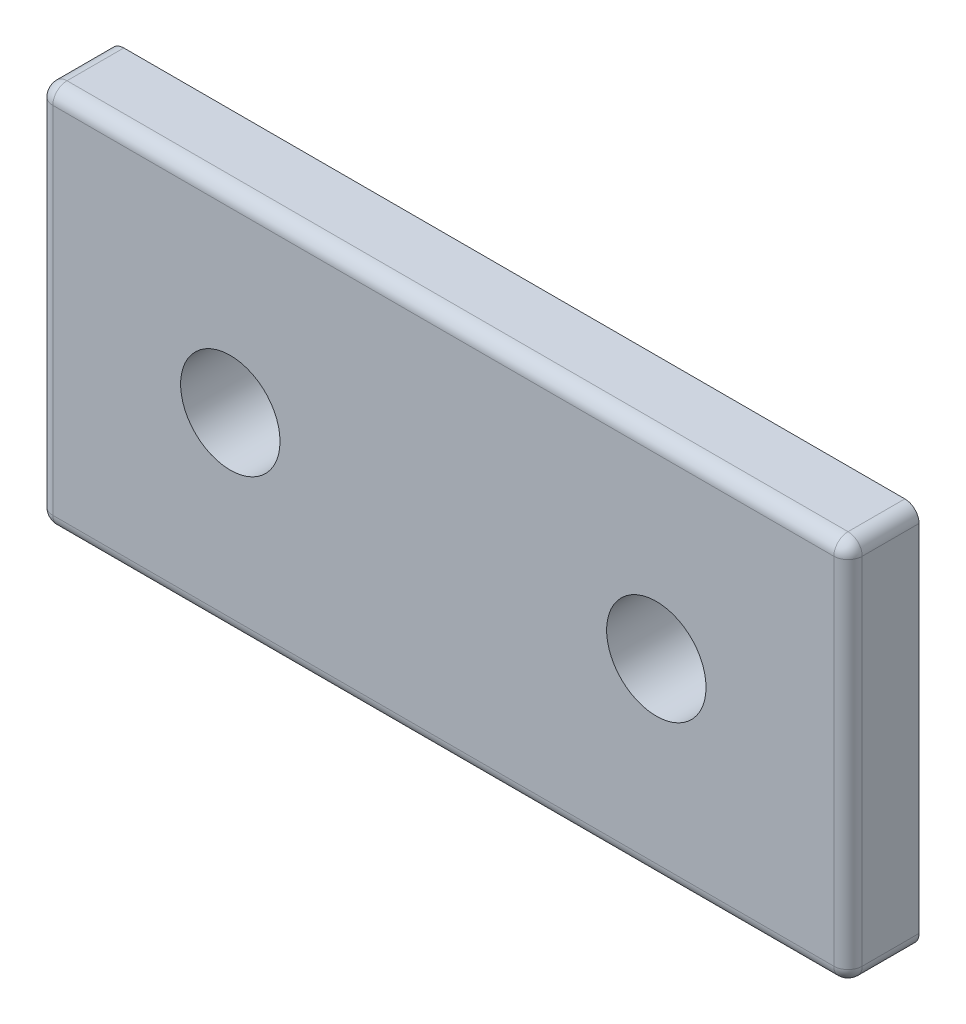
ISO-10303-21;
HEADER;
FILE_DESCRIPTION(('STEP AP214'),'2;1');
FILE_NAME('part.step','',(''),(''),'','','');
FILE_SCHEMA(('AUTOMOTIVE_DESIGN { 1 0 10303 214 1 1 1 1 }'));
ENDSEC;
DATA;
#1=APPLICATION_CONTEXT('core data for automotive mechanical design processes');
#2=APPLICATION_PROTOCOL_DEFINITION('international standard','automotive_design',2000,#1);
#3=PRODUCT_CONTEXT('',#1,'mechanical');
#4=PRODUCT('Part','Part','',(#3));
#5=PRODUCT_RELATED_PRODUCT_CATEGORY('part','',(#4));
#6=PRODUCT_DEFINITION_FORMATION('','',#4);
#7=PRODUCT_DEFINITION_CONTEXT('part definition',#1,'design');
#8=PRODUCT_DEFINITION('design','',#6,#7);
#9=PRODUCT_DEFINITION_SHAPE('','',#8);
#10=(LENGTH_UNIT() NAMED_UNIT(*) SI_UNIT(.MILLI.,.METRE.));
#11=(NAMED_UNIT(*) PLANE_ANGLE_UNIT() SI_UNIT($,.RADIAN.));
#12=(NAMED_UNIT(*) SI_UNIT($,.STERADIAN.) SOLID_ANGLE_UNIT());
#13=UNCERTAINTY_MEASURE_WITH_UNIT(LENGTH_MEASURE(1.E-05),#10,'distance_accuracy_value','');
#14=(GEOMETRIC_REPRESENTATION_CONTEXT(3) GLOBAL_UNCERTAINTY_ASSIGNED_CONTEXT((#13)) GLOBAL_UNIT_ASSIGNED_CONTEXT((#10,
#11,#12)) REPRESENTATION_CONTEXT('',''));
#15=CARTESIAN_POINT('',(0.,0.,0.));
#16=DIRECTION('',(0.,0.,1.));
#17=DIRECTION('',(1.,0.,0.));
#18=AXIS2_PLACEMENT_3D('',#15,#16,#17);
#19=CARTESIAN_POINT('',(0.,0.,2.5));
#20=DIRECTION('',(0.,0.,-1.));
#21=DIRECTION('',(-1.,0.,0.));
#22=AXIS2_PLACEMENT_3D('',#19,#20,#21);
#23=PLANE('',#22);
#24=DIRECTION('',(-1.,0.,0.));
#25=VECTOR('',#24,1.);
#26=CARTESIAN_POINT('',(0.,26.,2.5));
#27=LINE('',#26,#25);
#28=CARTESIAN_POINT('',(56.,26.,2.5));
#29=VERTEX_POINT('',#28);
#30=CARTESIAN_POINT('',(1.,26.,2.5));
#31=VERTEX_POINT('',#30);
#32=EDGE_CURVE('E286',#29,#31,#27,.T.);
#33=ORIENTED_EDGE('',*,*,#32,.T.);
#34=DIRECTION('',(0.,-1.,0.));
#35=VECTOR('',#34,1.);
#36=CARTESIAN_POINT('',(1.,0.,2.5));
#37=LINE('',#36,#35);
#38=CARTESIAN_POINT('',(1.,1.,2.5));
#39=VERTEX_POINT('',#38);
#40=EDGE_CURVE('E292',#31,#39,#37,.T.);
#41=ORIENTED_EDGE('',*,*,#40,.T.);
#42=DIRECTION('',(1.,0.,0.));
#43=VECTOR('',#42,1.);
#44=CARTESIAN_POINT('',(0.,1.,2.5));
#45=LINE('',#44,#43);
#46=CARTESIAN_POINT('',(56.,1.,2.5));
#47=VERTEX_POINT('',#46);
#48=EDGE_CURVE('E290',#39,#47,#45,.T.);
#49=ORIENTED_EDGE('',*,*,#48,.T.);
#50=DIRECTION('',(0.,1.,0.));
#51=VECTOR('',#50,1.);
#52=CARTESIAN_POINT('',(56.,0.,2.5));
#53=LINE('',#52,#51);
#54=EDGE_CURVE('E288',#47,#29,#53,.T.);
#55=ORIENTED_EDGE('',*,*,#54,.T.);
#56=EDGE_LOOP('',(#33,#41,#49,#55));
#57=FACE_BOUND('',#56,.T.);
#58=CARTESIAN_POINT('',(13.5,13.5,2.5));
#59=DIRECTION('',(0.,0.,1.));
#60=DIRECTION('',(1.,0.,0.));
#61=AXIS2_PLACEMENT_3D('',#58,#59,#60);
#62=CIRCLE('',#61,3.5);
#63=CARTESIAN_POINT('',(17.,13.5,2.5));
#64=VERTEX_POINT('',#63);
#65=EDGE_CURVE('E262',#64,#64,#62,.T.);
#66=ORIENTED_EDGE('',*,*,#65,.F.);
#67=EDGE_LOOP('',(#66));
#68=FACE_BOUND('',#67,.T.);
#69=CARTESIAN_POINT('',(43.5,13.5,2.5));
#70=DIRECTION('',(0.,0.,1.));
#71=DIRECTION('',(1.,0.,0.));
#72=AXIS2_PLACEMENT_3D('',#69,#70,#71);
#73=CIRCLE('',#72,3.5);
#74=CARTESIAN_POINT('',(47.,13.5,2.5));
#75=VERTEX_POINT('',#74);
#76=EDGE_CURVE('E341',#75,#75,#73,.T.);
#77=ORIENTED_EDGE('',*,*,#76,.F.);
#78=EDGE_LOOP('',(#77));
#79=FACE_BOUND('',#78,.T.);
#80=ADVANCED_FACE('F158',(#57,#68,#79),#23,.F.);
#81=CARTESIAN_POINT('',(0.,0.,-2.5));
#82=DIRECTION('',(0.,0.,-1.));
#83=DIRECTION('',(-1.,0.,0.));
#84=AXIS2_PLACEMENT_3D('',#81,#82,#83);
#85=PLANE('',#84);
#86=CARTESIAN_POINT('',(13.5,13.5,-2.5));
#87=DIRECTION('',(0.,0.,1.));
#88=DIRECTION('',(1.,0.,0.));
#89=AXIS2_PLACEMENT_3D('',#86,#87,#88);
#90=CIRCLE('',#89,3.5);
#91=CARTESIAN_POINT('',(17.,13.5,-2.5));
#92=VERTEX_POINT('',#91);
#93=EDGE_CURVE('E268',#92,#92,#90,.T.);
#94=ORIENTED_EDGE('',*,*,#93,.T.);
#95=EDGE_LOOP('',(#94));
#96=FACE_BOUND('',#95,.T.);
#97=DIRECTION('',(1.,0.,0.));
#98=VECTOR('',#97,1.);
#99=CARTESIAN_POINT('',(57.,0.,-2.5));
#100=LINE('',#99,#98);
#101=CARTESIAN_POINT('',(1.00000000000001,0.,-2.5));
#102=VERTEX_POINT('',#101);
#103=CARTESIAN_POINT('',(56.,0.,-2.5));
#104=VERTEX_POINT('',#103);
#105=EDGE_CURVE('E250',#102,#104,#100,.T.);
#106=ORIENTED_EDGE('',*,*,#105,.F.);
#107=CARTESIAN_POINT('',(1.,1.,-2.5));
#108=DIRECTION('',(0.,0.,-1.));
#109=DIRECTION('',(-1.,0.,0.));
#110=AXIS2_PLACEMENT_3D('',#107,#108,#109);
#111=CIRCLE('',#110,1.);
#112=CARTESIAN_POINT('',(0.,1.,-2.5));
#113=VERTEX_POINT('',#112);
#114=EDGE_CURVE('E234',#102,#113,#111,.T.);
#115=ORIENTED_EDGE('',*,*,#114,.T.);
#116=DIRECTION('',(0.,-1.,0.));
#117=VECTOR('',#116,1.);
#118=CARTESIAN_POINT('',(0.,0.,-2.5));
#119=LINE('',#118,#117);
#120=CARTESIAN_POINT('',(0.,26.,-2.5));
#121=VERTEX_POINT('',#120);
#122=EDGE_CURVE('E273',#121,#113,#119,.T.);
#123=ORIENTED_EDGE('',*,*,#122,.F.);
#124=CARTESIAN_POINT('',(1.,26.,-2.5));
#125=DIRECTION('',(0.,0.,-1.));
#126=DIRECTION('',(-1.,0.,0.));
#127=AXIS2_PLACEMENT_3D('',#124,#125,#126);
#128=CIRCLE('',#127,1.);
#129=CARTESIAN_POINT('',(1.00000000000001,27.,-2.5));
#130=VERTEX_POINT('',#129);
#131=EDGE_CURVE('E255',#121,#130,#128,.T.);
#132=ORIENTED_EDGE('',*,*,#131,.T.);
#133=DIRECTION('',(-1.,0.,0.));
#134=VECTOR('',#133,1.);
#135=CARTESIAN_POINT('',(57.,27.,-2.5));
#136=LINE('',#135,#134);
#137=CARTESIAN_POINT('',(56.,27.,-2.5));
#138=VERTEX_POINT('',#137);
#139=EDGE_CURVE('E265',#138,#130,#136,.T.);
#140=ORIENTED_EDGE('',*,*,#139,.F.);
#141=CARTESIAN_POINT('',(56.,26.,-2.5));
#142=DIRECTION('',(0.,0.,-1.));
#143=DIRECTION('',(-1.,0.,0.));
#144=AXIS2_PLACEMENT_3D('',#141,#142,#143);
#145=CIRCLE('',#144,1.);
#146=CARTESIAN_POINT('',(57.,26.,-2.5));
#147=VERTEX_POINT('',#146);
#148=EDGE_CURVE('E279',#138,#147,#145,.T.);
#149=ORIENTED_EDGE('',*,*,#148,.T.);
#150=DIRECTION('',(0.,1.,0.));
#151=VECTOR('',#150,1.);
#152=CARTESIAN_POINT('',(57.,27.,-2.5));
#153=LINE('',#152,#151);
#154=CARTESIAN_POINT('',(57.,1.,-2.5));
#155=VERTEX_POINT('',#154);
#156=EDGE_CURVE('E261',#155,#147,#153,.T.);
#157=ORIENTED_EDGE('',*,*,#156,.F.);
#158=CARTESIAN_POINT('',(56.,1.,-2.5));
#159=DIRECTION('',(0.,0.,-1.));
#160=DIRECTION('',(-1.,0.,0.));
#161=AXIS2_PLACEMENT_3D('',#158,#159,#160);
#162=CIRCLE('',#161,1.);
#163=EDGE_CURVE('E245',#155,#104,#162,.T.);
#164=ORIENTED_EDGE('',*,*,#163,.T.);
#165=EDGE_LOOP('',(#106,#115,#123,#132,#140,#149,#157,#164));
#166=FACE_BOUND('',#165,.T.);
#167=CARTESIAN_POINT('',(43.5,13.5,-2.5));
#168=DIRECTION('',(0.,0.,1.));
#169=DIRECTION('',(1.,0.,0.));
#170=AXIS2_PLACEMENT_3D('',#167,#168,#169);
#171=CIRCLE('',#170,3.5);
#172=CARTESIAN_POINT('',(47.,13.5,-2.5));
#173=VERTEX_POINT('',#172);
#174=EDGE_CURVE('E336',#173,#173,#171,.T.);
#175=ORIENTED_EDGE('',*,*,#174,.T.);
#176=EDGE_LOOP('',(#175));
#177=FACE_BOUND('',#176,.T.);
#178=ADVANCED_FACE('F257',(#96,#166,#177),#85,.T.);
#179=CARTESIAN_POINT('',(57.,0.,2.5));
#180=DIRECTION('',(0.,1.,0.));
#181=DIRECTION('',(-1.,0.,0.));
#182=AXIS2_PLACEMENT_3D('',#179,#180,#181);
#183=PLANE('',#182);
#184=DIRECTION('',(1.,0.,0.));
#185=VECTOR('',#184,1.);
#186=CARTESIAN_POINT('',(57.,0.,1.5));
#187=LINE('',#186,#185);
#188=CARTESIAN_POINT('',(56.,0.,1.5));
#189=VERTEX_POINT('',#188);
#190=CARTESIAN_POINT('',(1.,0.,1.5));
#191=VERTEX_POINT('',#190);
#192=EDGE_CURVE('E253',#189,#191,#187,.F.);
#193=ORIENTED_EDGE('',*,*,#192,.T.);
#194=DIRECTION('',(0.,0.,-1.));
#195=VECTOR('',#194,1.);
#196=CARTESIAN_POINT('',(1.,0.,2.5));
#197=LINE('',#196,#195);
#198=EDGE_CURVE('E238',#191,#102,#197,.T.);
#199=ORIENTED_EDGE('',*,*,#198,.T.);
#200=ORIENTED_EDGE('',*,*,#105,.T.);
#201=DIRECTION('',(0.,0.,-1.));
#202=VECTOR('',#201,1.);
#203=CARTESIAN_POINT('',(56.,0.,2.5));
#204=LINE('',#203,#202);
#205=EDGE_CURVE('E275',#104,#189,#204,.F.);
#206=ORIENTED_EDGE('',*,*,#205,.T.);
#207=EDGE_LOOP('',(#193,#199,#200,#206));
#208=FACE_BOUND('',#207,.T.);
#209=ADVANCED_FACE('F249',(#208),#183,.F.);
#210=CARTESIAN_POINT('',(57.,27.,2.5));
#211=DIRECTION('',(-1.,0.,0.));
#212=DIRECTION('',(0.,0.,1.));
#213=AXIS2_PLACEMENT_3D('',#210,#211,#212);
#214=PLANE('',#213);
#215=DIRECTION('',(0.,1.,0.));
#216=VECTOR('',#215,1.);
#217=CARTESIAN_POINT('',(57.,27.,1.5));
#218=LINE('',#217,#216);
#219=CARTESIAN_POINT('',(57.,26.,1.5));
#220=VERTEX_POINT('',#219);
#221=CARTESIAN_POINT('',(57.,1.,1.5));
#222=VERTEX_POINT('',#221);
#223=EDGE_CURVE('E297',#220,#222,#218,.F.);
#224=ORIENTED_EDGE('',*,*,#223,.T.);
#225=DIRECTION('',(0.,0.,-1.));
#226=VECTOR('',#225,1.);
#227=CARTESIAN_POINT('',(57.,1.,2.5));
#228=LINE('',#227,#226);
#229=EDGE_CURVE('E299',#222,#155,#228,.T.);
#230=ORIENTED_EDGE('',*,*,#229,.T.);
#231=ORIENTED_EDGE('',*,*,#156,.T.);
#232=DIRECTION('',(0.,0.,-1.));
#233=VECTOR('',#232,1.);
#234=CARTESIAN_POINT('',(57.,26.,2.5));
#235=LINE('',#234,#233);
#236=EDGE_CURVE('E295',#147,#220,#235,.F.);
#237=ORIENTED_EDGE('',*,*,#236,.T.);
#238=EDGE_LOOP('',(#224,#230,#231,#237));
#239=FACE_BOUND('',#238,.T.);
#240=ADVANCED_FACE('F377',(#239),#214,.F.);
#241=CARTESIAN_POINT('',(57.,27.,2.5));
#242=DIRECTION('',(0.,-1.,0.));
#243=DIRECTION('',(1.,0.,0.));
#244=AXIS2_PLACEMENT_3D('',#241,#242,#243);
#245=PLANE('',#244);
#246=DIRECTION('',(-1.,0.,0.));
#247=VECTOR('',#246,1.);
#248=CARTESIAN_POINT('',(57.,27.,1.5));
#249=LINE('',#248,#247);
#250=CARTESIAN_POINT('',(1.,27.,1.5));
#251=VERTEX_POINT('',#250);
#252=CARTESIAN_POINT('',(56.,27.,1.5));
#253=VERTEX_POINT('',#252);
#254=EDGE_CURVE('E167',#251,#253,#249,.F.);
#255=ORIENTED_EDGE('',*,*,#254,.T.);
#256=DIRECTION('',(0.,0.,-1.));
#257=VECTOR('',#256,1.);
#258=CARTESIAN_POINT('',(56.,27.,2.5));
#259=LINE('',#258,#257);
#260=EDGE_CURVE('E12',#253,#138,#259,.T.);
#261=ORIENTED_EDGE('',*,*,#260,.T.);
#262=ORIENTED_EDGE('',*,*,#139,.T.);
#263=DIRECTION('',(0.,0.,-1.));
#264=VECTOR('',#263,1.);
#265=CARTESIAN_POINT('',(1.,27.,2.5));
#266=LINE('',#265,#264);
#267=EDGE_CURVE('E178',#130,#251,#266,.F.);
#268=ORIENTED_EDGE('',*,*,#267,.T.);
#269=EDGE_LOOP('',(#255,#261,#262,#268));
#270=FACE_BOUND('',#269,.T.);
#271=ADVANCED_FACE('F363',(#270),#245,.F.);
#272=CARTESIAN_POINT('',(0.,0.,2.5));
#273=DIRECTION('',(1.,0.,0.));
#274=DIRECTION('',(0.,0.,-1.));
#275=AXIS2_PLACEMENT_3D('',#272,#273,#274);
#276=PLANE('',#275);
#277=ORIENTED_EDGE('',*,*,#122,.T.);
#278=DIRECTION('',(0.,0.,-1.));
#279=VECTOR('',#278,1.);
#280=CARTESIAN_POINT('',(0.,1.,2.5));
#281=LINE('',#280,#279);
#282=CARTESIAN_POINT('',(0.,1.,1.5));
#283=VERTEX_POINT('',#282);
#284=EDGE_CURVE('E239',#113,#283,#281,.F.);
#285=ORIENTED_EDGE('',*,*,#284,.T.);
#286=DIRECTION('',(0.,-1.,0.));
#287=VECTOR('',#286,1.);
#288=CARTESIAN_POINT('',(0.,0.,1.5));
#289=LINE('',#288,#287);
#290=CARTESIAN_POINT('',(0.,26.,1.5));
#291=VERTEX_POINT('',#290);
#292=EDGE_CURVE('E283',#283,#291,#289,.F.);
#293=ORIENTED_EDGE('',*,*,#292,.T.);
#294=DIRECTION('',(0.,0.,-1.));
#295=VECTOR('',#294,1.);
#296=CARTESIAN_POINT('',(0.,26.,2.5));
#297=LINE('',#296,#295);
#298=EDGE_CURVE('E244',#291,#121,#297,.T.);
#299=ORIENTED_EDGE('',*,*,#298,.T.);
#300=EDGE_LOOP('',(#277,#285,#293,#299));
#301=FACE_BOUND('',#300,.T.);
#302=ADVANCED_FACE('F355',(#301),#276,.F.);
#303=CARTESIAN_POINT('',(13.5,13.5,2.5));
#304=DIRECTION('',(0.,0.,-1.));
#305=DIRECTION('',(-1.,0.,0.));
#306=AXIS2_PLACEMENT_3D('',#303,#304,#305);
#307=CYLINDRICAL_SURFACE('',#306,3.5);
#308=ORIENTED_EDGE('',*,*,#65,.T.);
#309=EDGE_LOOP('',(#308));
#310=FACE_BOUND('',#309,.T.);
#311=ORIENTED_EDGE('',*,*,#93,.F.);
#312=EDGE_LOOP('',(#311));
#313=FACE_BOUND('',#312,.T.);
#314=ADVANCED_FACE('F352',(#310,#313),#307,.F.);
#315=CARTESIAN_POINT('',(43.5,13.5,2.5));
#316=DIRECTION('',(0.,0.,-1.));
#317=DIRECTION('',(-1.,0.,0.));
#318=AXIS2_PLACEMENT_3D('',#315,#316,#317);
#319=CYLINDRICAL_SURFACE('',#318,3.5);
#320=ORIENTED_EDGE('',*,*,#76,.T.);
#321=EDGE_LOOP('',(#320));
#322=FACE_BOUND('',#321,.T.);
#323=ORIENTED_EDGE('',*,*,#174,.F.);
#324=EDGE_LOOP('',(#323));
#325=FACE_BOUND('',#324,.T.);
#326=ADVANCED_FACE('F354',(#322,#325),#319,.F.);
#327=CARTESIAN_POINT('',(56.,26.,2.5));
#328=DIRECTION('',(0.,0.,-1.));
#329=DIRECTION('',(-1.,0.,0.));
#330=AXIS2_PLACEMENT_3D('',#327,#328,#329);
#331=CYLINDRICAL_SURFACE('',#330,1.);
#332=CARTESIAN_POINT('',(56.,26.,1.5));
#333=DIRECTION('',(0.,0.,1.));
#334=DIRECTION('',(1.,0.,0.));
#335=AXIS2_PLACEMENT_3D('',#332,#333,#334);
#336=CIRCLE('',#335,1.);
#337=EDGE_CURVE('E162',#220,#253,#336,.T.);
#338=ORIENTED_EDGE('',*,*,#337,.F.);
#339=ORIENTED_EDGE('',*,*,#236,.F.);
#340=ORIENTED_EDGE('',*,*,#148,.F.);
#341=ORIENTED_EDGE('',*,*,#260,.F.);
#342=EDGE_LOOP('',(#338,#339,#340,#341));
#343=FACE_BOUND('',#342,.T.);
#344=ADVANCED_FACE('F160',(#343),#331,.T.);
#345=CARTESIAN_POINT('',(56.,26.,1.5));
#346=DIRECTION('',(0.,0.,1.));
#347=DIRECTION('',(1.,0.,0.));
#348=AXIS2_PLACEMENT_3D('',#345,#346,#347);
#349=SPHERICAL_SURFACE('',#348,1.);
#350=CARTESIAN_POINT('',(56.,26.,1.5));
#351=DIRECTION('',(0.,1.,0.));
#352=DIRECTION('',(0.,0.,1.));
#353=AXIS2_PLACEMENT_3D('',#350,#351,#352);
#354=CIRCLE('',#353,1.);
#355=EDGE_CURVE('E328',#220,#29,#354,.F.);
#356=ORIENTED_EDGE('',*,*,#355,.F.);
#357=ORIENTED_EDGE('',*,*,#337,.T.);
#358=CARTESIAN_POINT('',(56.,26.,1.5));
#359=DIRECTION('',(1.,0.,0.));
#360=DIRECTION('',(0.,0.,-1.));
#361=AXIS2_PLACEMENT_3D('',#358,#359,#360);
#362=CIRCLE('',#361,1.);
#363=EDGE_CURVE('E330',#29,#253,#362,.F.);
#364=ORIENTED_EDGE('',*,*,#363,.F.);
#365=EDGE_LOOP('',(#356,#357,#364));
#366=FACE_BOUND('',#365,.T.);
#367=ADVANCED_FACE('F418',(#366),#349,.T.);
#368=CARTESIAN_POINT('',(1.,26.,2.5));
#369=DIRECTION('',(0.,0.,-1.));
#370=DIRECTION('',(-1.,0.,0.));
#371=AXIS2_PLACEMENT_3D('',#368,#369,#370);
#372=CYLINDRICAL_SURFACE('',#371,1.);
#373=ORIENTED_EDGE('',*,*,#131,.F.);
#374=ORIENTED_EDGE('',*,*,#298,.F.);
#375=CARTESIAN_POINT('',(1.,26.,1.5));
#376=DIRECTION('',(0.,0.,1.));
#377=DIRECTION('',(1.,0.,0.));
#378=AXIS2_PLACEMENT_3D('',#375,#376,#377);
#379=CIRCLE('',#378,1.);
#380=EDGE_CURVE('E325',#251,#291,#379,.T.);
#381=ORIENTED_EDGE('',*,*,#380,.F.);
#382=ORIENTED_EDGE('',*,*,#267,.F.);
#383=EDGE_LOOP('',(#373,#374,#381,#382));
#384=FACE_BOUND('',#383,.T.);
#385=ADVANCED_FACE('F416',(#384),#372,.T.);
#386=CARTESIAN_POINT('',(0.,26.,1.5));
#387=DIRECTION('',(-1.,0.,0.));
#388=DIRECTION('',(0.,-1.,0.));
#389=AXIS2_PLACEMENT_3D('',#386,#387,#388);
#390=CYLINDRICAL_SURFACE('',#389,1.);
#391=ORIENTED_EDGE('',*,*,#363,.T.);
#392=ORIENTED_EDGE('',*,*,#254,.F.);
#393=CARTESIAN_POINT('',(1.,26.,1.5));
#394=DIRECTION('',(-1.,0.,0.));
#395=DIRECTION('',(0.,-1.,0.));
#396=AXIS2_PLACEMENT_3D('',#393,#394,#395);
#397=CIRCLE('',#396,1.);
#398=EDGE_CURVE('E322',#31,#251,#397,.T.);
#399=ORIENTED_EDGE('',*,*,#398,.F.);
#400=ORIENTED_EDGE('',*,*,#32,.F.);
#401=EDGE_LOOP('',(#391,#392,#399,#400));
#402=FACE_BOUND('',#401,.T.);
#403=ADVANCED_FACE('F412',(#402),#390,.T.);
#404=CARTESIAN_POINT('',(56.,0.,1.5));
#405=DIRECTION('',(0.,1.,0.));
#406=DIRECTION('',(0.,0.,1.));
#407=AXIS2_PLACEMENT_3D('',#404,#405,#406);
#408=CYLINDRICAL_SURFACE('',#407,1.);
#409=ORIENTED_EDGE('',*,*,#355,.T.);
#410=ORIENTED_EDGE('',*,*,#54,.F.);
#411=CARTESIAN_POINT('',(56.,1.,1.5));
#412=DIRECTION('',(0.,-1.,0.));
#413=DIRECTION('',(0.,0.,-1.));
#414=AXIS2_PLACEMENT_3D('',#411,#412,#413);
#415=CIRCLE('',#414,1.);
#416=EDGE_CURVE('E319',#222,#47,#415,.T.);
#417=ORIENTED_EDGE('',*,*,#416,.F.);
#418=ORIENTED_EDGE('',*,*,#223,.F.);
#419=EDGE_LOOP('',(#409,#410,#417,#418));
#420=FACE_BOUND('',#419,.T.);
#421=ADVANCED_FACE('F408',(#420),#408,.T.);
#422=CARTESIAN_POINT('',(56.,1.,2.5));
#423=DIRECTION('',(0.,0.,-1.));
#424=DIRECTION('',(-1.,0.,0.));
#425=AXIS2_PLACEMENT_3D('',#422,#423,#424);
#426=CYLINDRICAL_SURFACE('',#425,1.);
#427=ORIENTED_EDGE('',*,*,#163,.F.);
#428=ORIENTED_EDGE('',*,*,#229,.F.);
#429=CARTESIAN_POINT('',(56.,1.,1.5));
#430=DIRECTION('',(0.,0.,1.));
#431=DIRECTION('',(1.,0.,0.));
#432=AXIS2_PLACEMENT_3D('',#429,#430,#431);
#433=CIRCLE('',#432,1.);
#434=EDGE_CURVE('E316',#189,#222,#433,.T.);
#435=ORIENTED_EDGE('',*,*,#434,.F.);
#436=ORIENTED_EDGE('',*,*,#205,.F.);
#437=EDGE_LOOP('',(#427,#428,#435,#436));
#438=FACE_BOUND('',#437,.T.);
#439=ADVANCED_FACE('F404',(#438),#426,.T.);
#440=CARTESIAN_POINT('',(1.,26.,1.5));
#441=DIRECTION('',(0.,0.,1.));
#442=DIRECTION('',(1.,0.,0.));
#443=AXIS2_PLACEMENT_3D('',#440,#441,#442);
#444=SPHERICAL_SURFACE('',#443,1.);
#445=ORIENTED_EDGE('',*,*,#398,.T.);
#446=ORIENTED_EDGE('',*,*,#380,.T.);
#447=CARTESIAN_POINT('',(1.,26.,1.5));
#448=DIRECTION('',(0.,1.,0.));
#449=DIRECTION('',(0.,0.,1.));
#450=AXIS2_PLACEMENT_3D('',#447,#448,#449);
#451=CIRCLE('',#450,1.);
#452=EDGE_CURVE('E313',#31,#291,#451,.F.);
#453=ORIENTED_EDGE('',*,*,#452,.F.);
#454=EDGE_LOOP('',(#445,#446,#453));
#455=FACE_BOUND('',#454,.T.);
#456=ADVANCED_FACE('F400',(#455),#444,.T.);
#457=CARTESIAN_POINT('',(56.,1.,1.5));
#458=DIRECTION('',(0.,0.,1.));
#459=DIRECTION('',(1.,0.,0.));
#460=AXIS2_PLACEMENT_3D('',#457,#458,#459);
#461=SPHERICAL_SURFACE('',#460,1.);
#462=ORIENTED_EDGE('',*,*,#434,.T.);
#463=ORIENTED_EDGE('',*,*,#416,.T.);
#464=CARTESIAN_POINT('',(56.,1.,1.5));
#465=DIRECTION('',(1.,0.,0.));
#466=DIRECTION('',(0.,0.,-1.));
#467=AXIS2_PLACEMENT_3D('',#464,#465,#466);
#468=CIRCLE('',#467,1.);
#469=EDGE_CURVE('E310',#189,#47,#468,.F.);
#470=ORIENTED_EDGE('',*,*,#469,.F.);
#471=EDGE_LOOP('',(#462,#463,#470));
#472=FACE_BOUND('',#471,.T.);
#473=ADVANCED_FACE('F396',(#472),#461,.T.);
#474=CARTESIAN_POINT('',(1.,0.,1.5));
#475=DIRECTION('',(0.,-1.,0.));
#476=DIRECTION('',(0.,0.,-1.));
#477=AXIS2_PLACEMENT_3D('',#474,#475,#476);
#478=CYLINDRICAL_SURFACE('',#477,1.);
#479=ORIENTED_EDGE('',*,*,#452,.T.);
#480=ORIENTED_EDGE('',*,*,#292,.F.);
#481=CARTESIAN_POINT('',(1.,1.,1.5));
#482=DIRECTION('',(0.,-1.,0.));
#483=DIRECTION('',(0.,0.,-1.));
#484=AXIS2_PLACEMENT_3D('',#481,#482,#483);
#485=CIRCLE('',#484,1.);
#486=EDGE_CURVE('E307',#39,#283,#485,.T.);
#487=ORIENTED_EDGE('',*,*,#486,.F.);
#488=ORIENTED_EDGE('',*,*,#40,.F.);
#489=EDGE_LOOP('',(#479,#480,#487,#488));
#490=FACE_BOUND('',#489,.T.);
#491=ADVANCED_FACE('F392',(#490),#478,.T.);
#492=CARTESIAN_POINT('',(0.,1.,1.5));
#493=DIRECTION('',(1.,0.,0.));
#494=DIRECTION('',(0.,1.,0.));
#495=AXIS2_PLACEMENT_3D('',#492,#493,#494);
#496=CYLINDRICAL_SURFACE('',#495,1.);
#497=ORIENTED_EDGE('',*,*,#469,.T.);
#498=ORIENTED_EDGE('',*,*,#48,.F.);
#499=CARTESIAN_POINT('',(1.,1.,1.5));
#500=DIRECTION('',(-1.,0.,0.));
#501=DIRECTION('',(0.,0.,1.));
#502=AXIS2_PLACEMENT_3D('',#499,#500,#501);
#503=CIRCLE('',#502,1.);
#504=EDGE_CURVE('E305',#191,#39,#503,.T.);
#505=ORIENTED_EDGE('',*,*,#504,.F.);
#506=ORIENTED_EDGE('',*,*,#192,.F.);
#507=EDGE_LOOP('',(#497,#498,#505,#506));
#508=FACE_BOUND('',#507,.T.);
#509=ADVANCED_FACE('F388',(#508),#496,.T.);
#510=CARTESIAN_POINT('',(1.,1.,1.5));
#511=DIRECTION('',(0.,0.,1.));
#512=DIRECTION('',(1.,0.,0.));
#513=AXIS2_PLACEMENT_3D('',#510,#511,#512);
#514=SPHERICAL_SURFACE('',#513,1.);
#515=ORIENTED_EDGE('',*,*,#504,.T.);
#516=ORIENTED_EDGE('',*,*,#486,.T.);
#517=CARTESIAN_POINT('',(1.,1.,1.5));
#518=DIRECTION('',(0.,0.,1.));
#519=DIRECTION('',(1.,0.,0.));
#520=AXIS2_PLACEMENT_3D('',#517,#518,#519);
#521=CIRCLE('',#520,1.);
#522=EDGE_CURVE('E303',#191,#283,#521,.F.);
#523=ORIENTED_EDGE('',*,*,#522,.F.);
#524=EDGE_LOOP('',(#515,#516,#523));
#525=FACE_BOUND('',#524,.T.);
#526=ADVANCED_FACE('F385',(#525),#514,.T.);
#527=CARTESIAN_POINT('',(1.,1.,2.5));
#528=DIRECTION('',(0.,0.,-1.));
#529=DIRECTION('',(-1.,0.,0.));
#530=AXIS2_PLACEMENT_3D('',#527,#528,#529);
#531=CYLINDRICAL_SURFACE('',#530,1.);
#532=ORIENTED_EDGE('',*,*,#522,.T.);
#533=ORIENTED_EDGE('',*,*,#284,.F.);
#534=ORIENTED_EDGE('',*,*,#114,.F.);
#535=ORIENTED_EDGE('',*,*,#198,.F.);
#536=EDGE_LOOP('',(#532,#533,#534,#535));
#537=FACE_BOUND('',#536,.T.);
#538=ADVANCED_FACE('F237',(#537),#531,.T.);
#539=CLOSED_SHELL('',(#80,#178,#209,#240,#271,#302,#314,#326,#344,#367,#385,#403,#421,#439,#456,
#473,#491,#509,#526,#538));
#540=MANIFOLD_SOLID_BREP('B2',#539);
#541=ADVANCED_BREP_SHAPE_REPRESENTATION('',(#18,#540),#14);
#542=SHAPE_DEFINITION_REPRESENTATION(#9,#541);
ENDSEC;
END-ISO-10303-21;
